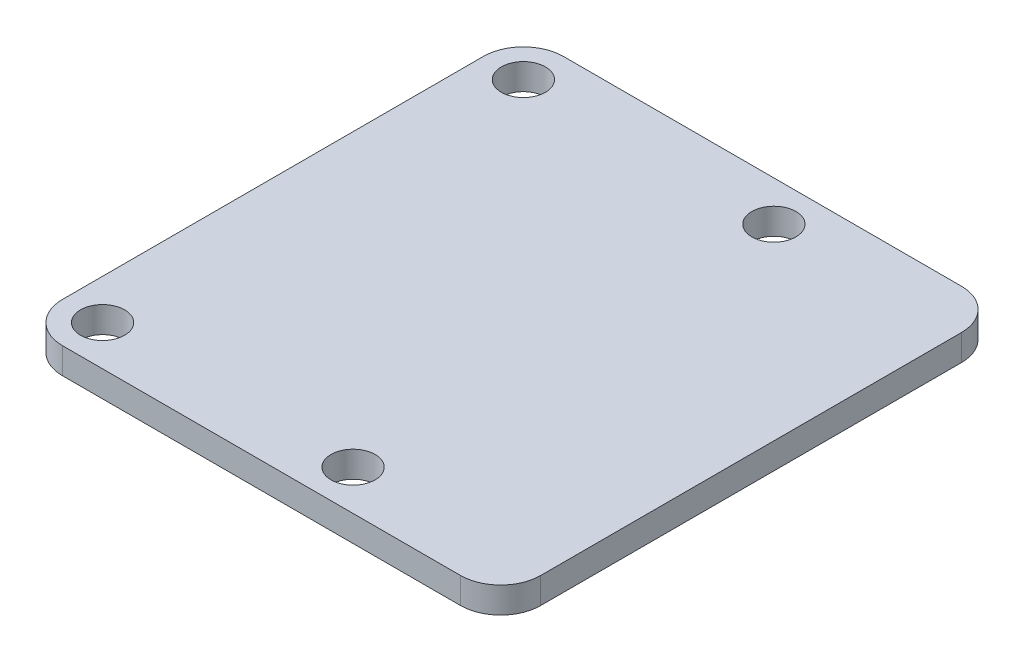
ISO-10303-21;
HEADER;
FILE_DESCRIPTION(('STEP AP214'),'2;1');
FILE_NAME('part.step','',(''),(''),'','','');
FILE_SCHEMA(('AUTOMOTIVE_DESIGN { 1 0 10303 214 1 1 1 1 }'));
ENDSEC;
DATA;
#1=APPLICATION_CONTEXT('core data for automotive mechanical design processes');
#2=APPLICATION_PROTOCOL_DEFINITION('international standard','automotive_design',2000,#1);
#3=PRODUCT_CONTEXT('',#1,'mechanical');
#4=PRODUCT('Part','Part','',(#3));
#5=PRODUCT_RELATED_PRODUCT_CATEGORY('part','',(#4));
#6=PRODUCT_DEFINITION_FORMATION('','',#4);
#7=PRODUCT_DEFINITION_CONTEXT('part definition',#1,'design');
#8=PRODUCT_DEFINITION('design','',#6,#7);
#9=PRODUCT_DEFINITION_SHAPE('','',#8);
#10=(LENGTH_UNIT() NAMED_UNIT(*) SI_UNIT(.MILLI.,.METRE.));
#11=(NAMED_UNIT(*) PLANE_ANGLE_UNIT() SI_UNIT($,.RADIAN.));
#12=(NAMED_UNIT(*) SI_UNIT($,.STERADIAN.) SOLID_ANGLE_UNIT());
#13=UNCERTAINTY_MEASURE_WITH_UNIT(LENGTH_MEASURE(1.E-05),#10,'distance_accuracy_value','');
#14=(GEOMETRIC_REPRESENTATION_CONTEXT(3) GLOBAL_UNCERTAINTY_ASSIGNED_CONTEXT((#13)) GLOBAL_UNIT_ASSIGNED_CONTEXT((#10,
#11,#12)) REPRESENTATION_CONTEXT('',''));
#15=CARTESIAN_POINT('',(0.,0.,0.));
#16=DIRECTION('',(0.,0.,1.));
#17=DIRECTION('',(1.,0.,0.));
#18=AXIS2_PLACEMENT_3D('',#15,#16,#17);
#19=CARTESIAN_POINT('',(0.,0.,0.));
#20=DIRECTION('',(0.,1.,0.));
#21=DIRECTION('',(0.,0.,1.));
#22=AXIS2_PLACEMENT_3D('',#19,#20,#21);
#23=PLANE('',#22);
#24=CARTESIAN_POINT('',(2.56900000000003,0.,-10.5));
#25=DIRECTION('',(0.,1.,0.));
#26=DIRECTION('',(0.,0.,1.));
#27=AXIS2_PLACEMENT_3D('',#24,#25,#26);
#28=CIRCLE('',#27,1.1);
#29=CARTESIAN_POINT('',(2.56900000000003,0.,-9.4));
#30=VERTEX_POINT('',#29);
#31=EDGE_CURVE('E150',#30,#30,#28,.T.);
#32=ORIENTED_EDGE('',*,*,#31,.T.);
#33=EDGE_LOOP('',(#32));
#34=FACE_BOUND('',#33,.T.);
#35=CARTESIAN_POINT('',(-9.93099999999997,0.,-10.5));
#36=DIRECTION('',(0.,1.,0.));
#37=DIRECTION('',(0.,0.,1.));
#38=AXIS2_PLACEMENT_3D('',#35,#36,#37);
#39=CIRCLE('',#38,1.1);
#40=CARTESIAN_POINT('',(-9.93099999999997,0.,-9.4));
#41=VERTEX_POINT('',#40);
#42=EDGE_CURVE('E160',#41,#41,#39,.T.);
#43=ORIENTED_EDGE('',*,*,#42,.T.);
#44=EDGE_LOOP('',(#43));
#45=FACE_BOUND('',#44,.T.);
#46=CARTESIAN_POINT('',(2.56900000000003,0.,10.5));
#47=DIRECTION('',(0.,1.,0.));
#48=DIRECTION('',(0.,0.,1.));
#49=AXIS2_PLACEMENT_3D('',#46,#47,#48);
#50=CIRCLE('',#49,1.1);
#51=CARTESIAN_POINT('',(2.56900000000003,0.,11.6));
#52=VERTEX_POINT('',#51);
#53=EDGE_CURVE('E165',#52,#52,#50,.T.);
#54=ORIENTED_EDGE('',*,*,#53,.T.);
#55=EDGE_LOOP('',(#54));
#56=FACE_BOUND('',#55,.T.);
#57=CARTESIAN_POINT('',(-9.93099999999997,0.,10.5));
#58=DIRECTION('',(0.,1.,0.));
#59=DIRECTION('',(0.,0.,1.));
#60=AXIS2_PLACEMENT_3D('',#57,#58,#59);
#61=CIRCLE('',#60,1.1);
#62=CARTESIAN_POINT('',(-9.93099999999997,0.,11.6));
#63=VERTEX_POINT('',#62);
#64=EDGE_CURVE('E171',#63,#63,#61,.T.);
#65=ORIENTED_EDGE('',*,*,#64,.T.);
#66=EDGE_LOOP('',(#65));
#67=FACE_BOUND('',#66,.T.);
#68=DIRECTION('',(-1.,0.,0.));
#69=VECTOR('',#68,1.);
#70=CARTESIAN_POINT('',(-11.931,0.,-12.5));
#71=LINE('',#70,#69);
#72=CARTESIAN_POINT('',(9.93099999999997,0.,-12.5));
#73=VERTEX_POINT('',#72);
#74=CARTESIAN_POINT('',(-9.93099999999997,0.,-12.5));
#75=VERTEX_POINT('',#74);
#76=EDGE_CURVE('E194',#73,#75,#71,.T.);
#77=ORIENTED_EDGE('',*,*,#76,.F.);
#78=CARTESIAN_POINT('',(9.93099999999997,0.,-10.5));
#79=DIRECTION('',(0.,1.,0.));
#80=DIRECTION('',(0.,0.,1.));
#81=AXIS2_PLACEMENT_3D('',#78,#79,#80);
#82=CIRCLE('',#81,2.);
#83=CARTESIAN_POINT('',(11.931,0.,-10.5));
#84=VERTEX_POINT('',#83);
#85=EDGE_CURVE('E214',#73,#84,#82,.F.);
#86=ORIENTED_EDGE('',*,*,#85,.T.);
#87=DIRECTION('',(0.,0.,-1.));
#88=VECTOR('',#87,1.);
#89=CARTESIAN_POINT('',(11.931,0.,-12.5));
#90=LINE('',#89,#88);
#91=CARTESIAN_POINT('',(11.931,0.,10.5));
#92=VERTEX_POINT('',#91);
#93=EDGE_CURVE('E177',#92,#84,#90,.T.);
#94=ORIENTED_EDGE('',*,*,#93,.F.);
#95=CARTESIAN_POINT('',(9.93099999999997,0.,10.5));
#96=DIRECTION('',(0.,1.,0.));
#97=DIRECTION('',(0.,0.,1.));
#98=AXIS2_PLACEMENT_3D('',#95,#96,#97);
#99=CIRCLE('',#98,2.);
#100=CARTESIAN_POINT('',(9.93099999999997,0.,12.5));
#101=VERTEX_POINT('',#100);
#102=EDGE_CURVE('E208',#92,#101,#99,.F.);
#103=ORIENTED_EDGE('',*,*,#102,.T.);
#104=DIRECTION('',(1.,0.,0.));
#105=VECTOR('',#104,1.);
#106=CARTESIAN_POINT('',(-11.931,0.,12.5));
#107=LINE('',#106,#105);
#108=CARTESIAN_POINT('',(-9.93099999999997,0.,12.5));
#109=VERTEX_POINT('',#108);
#110=EDGE_CURVE('E184',#109,#101,#107,.T.);
#111=ORIENTED_EDGE('',*,*,#110,.F.);
#112=CARTESIAN_POINT('',(-9.93099999999997,0.,10.5));
#113=DIRECTION('',(0.,1.,0.));
#114=DIRECTION('',(0.,0.,1.));
#115=AXIS2_PLACEMENT_3D('',#112,#113,#114);
#116=CIRCLE('',#115,2.);
#117=CARTESIAN_POINT('',(-11.931,0.,10.5));
#118=VERTEX_POINT('',#117);
#119=EDGE_CURVE('E210',#109,#118,#116,.F.);
#120=ORIENTED_EDGE('',*,*,#119,.T.);
#121=DIRECTION('',(0.,0.,1.));
#122=VECTOR('',#121,1.);
#123=CARTESIAN_POINT('',(-11.931,0.,-12.5));
#124=LINE('',#123,#122);
#125=CARTESIAN_POINT('',(-11.931,0.,-10.5));
#126=VERTEX_POINT('',#125);
#127=EDGE_CURVE('E197',#126,#118,#124,.T.);
#128=ORIENTED_EDGE('',*,*,#127,.F.);
#129=CARTESIAN_POINT('',(-9.93099999999997,0.,-10.5));
#130=DIRECTION('',(0.,1.,0.));
#131=DIRECTION('',(0.,0.,1.));
#132=AXIS2_PLACEMENT_3D('',#129,#130,#131);
#133=CIRCLE('',#132,2.);
#134=EDGE_CURVE('E212',#126,#75,#133,.F.);
#135=ORIENTED_EDGE('',*,*,#134,.T.);
#136=EDGE_LOOP('',(#77,#86,#94,#103,#111,#120,#128,#135));
#137=FACE_BOUND('',#136,.T.);
#138=DIRECTION('',(0.,0.,1.));
#139=VECTOR('',#138,1.);
#140=CARTESIAN_POINT('',(6.46899999999997,0.,-4.));
#141=LINE('',#140,#139);
#142=CARTESIAN_POINT('',(6.46899999999997,0.,-4.));
#143=VERTEX_POINT('',#142);
#144=CARTESIAN_POINT('',(6.46899999999997,0.,4.));
#145=VERTEX_POINT('',#144);
#146=EDGE_CURVE('E149',#143,#145,#141,.T.);
#147=ORIENTED_EDGE('',*,*,#146,.F.);
#148=DIRECTION('',(1.,0.,0.));
#149=VECTOR('',#148,1.);
#150=CARTESIAN_POINT('',(-1.53100000000003,0.,-4.));
#151=LINE('',#150,#149);
#152=CARTESIAN_POINT('',(-1.53100000000003,0.,-4.));
#153=VERTEX_POINT('',#152);
#154=EDGE_CURVE('E146',#153,#143,#151,.T.);
#155=ORIENTED_EDGE('',*,*,#154,.F.);
#156=DIRECTION('',(0.,0.,-1.));
#157=VECTOR('',#156,1.);
#158=CARTESIAN_POINT('',(-1.53100000000003,0.,-4.));
#159=LINE('',#158,#157);
#160=CARTESIAN_POINT('',(-1.53100000000003,0.,4.));
#161=VERTEX_POINT('',#160);
#162=EDGE_CURVE('E464',#161,#153,#159,.T.);
#163=ORIENTED_EDGE('',*,*,#162,.F.);
#164=DIRECTION('',(-1.,0.,0.));
#165=VECTOR('',#164,1.);
#166=CARTESIAN_POINT('',(-1.53100000000003,0.,4.));
#167=LINE('',#166,#165);
#168=EDGE_CURVE('E457',#145,#161,#167,.T.);
#169=ORIENTED_EDGE('',*,*,#168,.F.);
#170=EDGE_LOOP('',(#147,#155,#163,#169));
#171=FACE_BOUND('',#170,.T.);
#172=ADVANCED_FACE('F35',(#34,#45,#56,#67,#137,#171),#23,.F.);
#173=CARTESIAN_POINT('',(0.,1.3,0.));
#174=DIRECTION('',(0.,1.,0.));
#175=DIRECTION('',(0.,0.,1.));
#176=AXIS2_PLACEMENT_3D('',#173,#174,#175);
#177=PLANE('',#176);
#178=CARTESIAN_POINT('',(-9.93099999999997,1.3,-10.5));
#179=DIRECTION('',(0.,1.,0.));
#180=DIRECTION('',(0.,0.,1.));
#181=AXIS2_PLACEMENT_3D('',#178,#179,#180);
#182=CIRCLE('',#181,1.1);
#183=CARTESIAN_POINT('',(-9.93099999999997,1.3,-9.4));
#184=VERTEX_POINT('',#183);
#185=EDGE_CURVE('E162',#184,#184,#182,.T.);
#186=ORIENTED_EDGE('',*,*,#185,.F.);
#187=EDGE_LOOP('',(#186));
#188=FACE_BOUND('',#187,.T.);
#189=CARTESIAN_POINT('',(-9.93099999999997,1.3,10.5));
#190=DIRECTION('',(0.,1.,0.));
#191=DIRECTION('',(0.,0.,1.));
#192=AXIS2_PLACEMENT_3D('',#189,#190,#191);
#193=CIRCLE('',#192,1.1);
#194=CARTESIAN_POINT('',(-9.93099999999997,1.3,11.6));
#195=VERTEX_POINT('',#194);
#196=EDGE_CURVE('E174',#195,#195,#193,.T.);
#197=ORIENTED_EDGE('',*,*,#196,.F.);
#198=EDGE_LOOP('',(#197));
#199=FACE_BOUND('',#198,.T.);
#200=DIRECTION('',(0.,0.,-1.));
#201=VECTOR('',#200,1.);
#202=CARTESIAN_POINT('',(11.931,1.3,-12.5));
#203=LINE('',#202,#201);
#204=CARTESIAN_POINT('',(11.931,1.3,10.5));
#205=VERTEX_POINT('',#204);
#206=CARTESIAN_POINT('',(11.931,1.3,-10.5));
#207=VERTEX_POINT('',#206);
#208=EDGE_CURVE('E180',#205,#207,#203,.T.);
#209=ORIENTED_EDGE('',*,*,#208,.T.);
#210=CARTESIAN_POINT('',(9.93099999999997,1.3,-10.5));
#211=DIRECTION('',(0.,1.,0.));
#212=DIRECTION('',(0.,0.,1.));
#213=AXIS2_PLACEMENT_3D('',#210,#211,#212);
#214=CIRCLE('',#213,2.);
#215=CARTESIAN_POINT('',(9.93099999999997,1.3,-12.5));
#216=VERTEX_POINT('',#215);
#217=EDGE_CURVE('E226',#207,#216,#214,.T.);
#218=ORIENTED_EDGE('',*,*,#217,.T.);
#219=DIRECTION('',(-1.,0.,0.));
#220=VECTOR('',#219,1.);
#221=CARTESIAN_POINT('',(-11.931,1.3,-12.5));
#222=LINE('',#221,#220);
#223=CARTESIAN_POINT('',(-9.93099999999997,1.3,-12.5));
#224=VERTEX_POINT('',#223);
#225=EDGE_CURVE('E183',#216,#224,#222,.T.);
#226=ORIENTED_EDGE('',*,*,#225,.T.);
#227=CARTESIAN_POINT('',(-9.93099999999997,1.3,-10.5));
#228=DIRECTION('',(0.,1.,0.));
#229=DIRECTION('',(0.,0.,1.));
#230=AXIS2_PLACEMENT_3D('',#227,#228,#229);
#231=CIRCLE('',#230,2.);
#232=CARTESIAN_POINT('',(-11.931,1.3,-10.5));
#233=VERTEX_POINT('',#232);
#234=EDGE_CURVE('E224',#224,#233,#231,.T.);
#235=ORIENTED_EDGE('',*,*,#234,.T.);
#236=DIRECTION('',(0.,0.,1.));
#237=VECTOR('',#236,1.);
#238=CARTESIAN_POINT('',(-11.931,1.3,-12.5));
#239=LINE('',#238,#237);
#240=CARTESIAN_POINT('',(-11.931,1.3,10.5));
#241=VERTEX_POINT('',#240);
#242=EDGE_CURVE('E187',#233,#241,#239,.T.);
#243=ORIENTED_EDGE('',*,*,#242,.T.);
#244=CARTESIAN_POINT('',(-9.93099999999997,1.3,10.5));
#245=DIRECTION('',(0.,1.,0.));
#246=DIRECTION('',(0.,0.,1.));
#247=AXIS2_PLACEMENT_3D('',#244,#245,#246);
#248=CIRCLE('',#247,2.);
#249=CARTESIAN_POINT('',(-9.93099999999997,1.3,12.5));
#250=VERTEX_POINT('',#249);
#251=EDGE_CURVE('E56',#241,#250,#248,.T.);
#252=ORIENTED_EDGE('',*,*,#251,.T.);
#253=DIRECTION('',(1.,0.,0.));
#254=VECTOR('',#253,1.);
#255=CARTESIAN_POINT('',(-11.931,1.3,12.5));
#256=LINE('',#255,#254);
#257=CARTESIAN_POINT('',(9.93099999999997,1.3,12.5));
#258=VERTEX_POINT('',#257);
#259=EDGE_CURVE('E189',#250,#258,#256,.T.);
#260=ORIENTED_EDGE('',*,*,#259,.T.);
#261=CARTESIAN_POINT('',(9.93099999999997,1.3,10.5));
#262=DIRECTION('',(0.,1.,0.));
#263=DIRECTION('',(0.,0.,1.));
#264=AXIS2_PLACEMENT_3D('',#261,#262,#263);
#265=CIRCLE('',#264,2.);
#266=EDGE_CURVE('E221',#258,#205,#265,.T.);
#267=ORIENTED_EDGE('',*,*,#266,.T.);
#268=EDGE_LOOP('',(#209,#218,#226,#235,#243,#252,#260,#267));
#269=FACE_BOUND('',#268,.T.);
#270=CARTESIAN_POINT('',(2.56900000000003,1.3,10.5));
#271=DIRECTION('',(0.,1.,0.));
#272=DIRECTION('',(0.,0.,1.));
#273=AXIS2_PLACEMENT_3D('',#270,#271,#272);
#274=CIRCLE('',#273,1.1);
#275=CARTESIAN_POINT('',(2.56900000000003,1.3,11.6));
#276=VERTEX_POINT('',#275);
#277=EDGE_CURVE('E168',#276,#276,#274,.T.);
#278=ORIENTED_EDGE('',*,*,#277,.F.);
#279=EDGE_LOOP('',(#278));
#280=FACE_BOUND('',#279,.T.);
#281=CARTESIAN_POINT('',(2.56900000000003,1.3,-10.5));
#282=DIRECTION('',(0.,1.,0.));
#283=DIRECTION('',(0.,0.,1.));
#284=AXIS2_PLACEMENT_3D('',#281,#282,#283);
#285=CIRCLE('',#284,1.1);
#286=CARTESIAN_POINT('',(2.56900000000003,1.3,-9.4));
#287=VERTEX_POINT('',#286);
#288=EDGE_CURVE('E153',#287,#287,#285,.T.);
#289=ORIENTED_EDGE('',*,*,#288,.F.);
#290=EDGE_LOOP('',(#289));
#291=FACE_BOUND('',#290,.T.);
#292=ADVANCED_FACE('F249',(#188,#199,#269,#280,#291),#177,.T.);
#293=CARTESIAN_POINT('',(11.931,1.3,-12.5));
#294=DIRECTION('',(-1.,0.,0.));
#295=DIRECTION('',(0.,0.,1.));
#296=AXIS2_PLACEMENT_3D('',#293,#294,#295);
#297=PLANE('',#296);
#298=ORIENTED_EDGE('',*,*,#93,.T.);
#299=DIRECTION('',(0.,-1.,0.));
#300=VECTOR('',#299,1.);
#301=CARTESIAN_POINT('',(11.931,1.3,-10.5));
#302=LINE('',#301,#300);
#303=EDGE_CURVE('E219',#84,#207,#302,.F.);
#304=ORIENTED_EDGE('',*,*,#303,.T.);
#305=ORIENTED_EDGE('',*,*,#208,.F.);
#306=DIRECTION('',(0.,-1.,0.));
#307=VECTOR('',#306,1.);
#308=CARTESIAN_POINT('',(11.931,1.3,10.5));
#309=LINE('',#308,#307);
#310=EDGE_CURVE('E216',#205,#92,#309,.T.);
#311=ORIENTED_EDGE('',*,*,#310,.T.);
#312=EDGE_LOOP('',(#298,#304,#305,#311));
#313=FACE_BOUND('',#312,.T.);
#314=ADVANCED_FACE('F256',(#313),#297,.F.);
#315=CARTESIAN_POINT('',(-11.931,1.3,-12.5));
#316=DIRECTION('',(0.,0.,1.));
#317=DIRECTION('',(1.,0.,0.));
#318=AXIS2_PLACEMENT_3D('',#315,#316,#317);
#319=PLANE('',#318);
#320=ORIENTED_EDGE('',*,*,#225,.F.);
#321=DIRECTION('',(0.,-1.,0.));
#322=VECTOR('',#321,1.);
#323=CARTESIAN_POINT('',(9.93099999999997,1.3,-12.5));
#324=LINE('',#323,#322);
#325=EDGE_CURVE('E205',#216,#73,#324,.T.);
#326=ORIENTED_EDGE('',*,*,#325,.T.);
#327=ORIENTED_EDGE('',*,*,#76,.T.);
#328=DIRECTION('',(0.,-1.,0.));
#329=VECTOR('',#328,1.);
#330=CARTESIAN_POINT('',(-9.93099999999997,1.3,-12.5));
#331=LINE('',#330,#329);
#332=EDGE_CURVE('E203',#75,#224,#331,.F.);
#333=ORIENTED_EDGE('',*,*,#332,.T.);
#334=EDGE_LOOP('',(#320,#326,#327,#333));
#335=FACE_BOUND('',#334,.T.);
#336=ADVANCED_FACE('F264',(#335),#319,.F.);
#337=CARTESIAN_POINT('',(-11.931,1.3,-12.5));
#338=DIRECTION('',(1.,0.,0.));
#339=DIRECTION('',(0.,0.,-1.));
#340=AXIS2_PLACEMENT_3D('',#337,#338,#339);
#341=PLANE('',#340);
#342=ORIENTED_EDGE('',*,*,#242,.F.);
#343=DIRECTION('',(0.,-1.,0.));
#344=VECTOR('',#343,1.);
#345=CARTESIAN_POINT('',(-11.931,1.3,-10.5));
#346=LINE('',#345,#344);
#347=EDGE_CURVE('E230',#233,#126,#346,.T.);
#348=ORIENTED_EDGE('',*,*,#347,.T.);
#349=ORIENTED_EDGE('',*,*,#127,.T.);
#350=DIRECTION('',(0.,-1.,0.));
#351=VECTOR('',#350,1.);
#352=CARTESIAN_POINT('',(-11.931,1.3,10.5));
#353=LINE('',#352,#351);
#354=EDGE_CURVE('E228',#118,#241,#353,.F.);
#355=ORIENTED_EDGE('',*,*,#354,.T.);
#356=EDGE_LOOP('',(#342,#348,#349,#355));
#357=FACE_BOUND('',#356,.T.);
#358=ADVANCED_FACE('F236',(#357),#341,.F.);
#359=CARTESIAN_POINT('',(-11.931,1.3,12.5));
#360=DIRECTION('',(0.,0.,-1.));
#361=DIRECTION('',(-1.,0.,0.));
#362=AXIS2_PLACEMENT_3D('',#359,#360,#361);
#363=PLANE('',#362);
#364=ORIENTED_EDGE('',*,*,#259,.F.);
#365=DIRECTION('',(0.,-1.,0.));
#366=VECTOR('',#365,1.);
#367=CARTESIAN_POINT('',(-9.93099999999997,1.3,12.5));
#368=LINE('',#367,#366);
#369=EDGE_CURVE('E11',#250,#109,#368,.T.);
#370=ORIENTED_EDGE('',*,*,#369,.T.);
#371=ORIENTED_EDGE('',*,*,#110,.T.);
#372=DIRECTION('',(0.,-1.,0.));
#373=VECTOR('',#372,1.);
#374=CARTESIAN_POINT('',(9.93099999999997,1.3,12.5));
#375=LINE('',#374,#373);
#376=EDGE_CURVE('E43',#101,#258,#375,.F.);
#377=ORIENTED_EDGE('',*,*,#376,.T.);
#378=EDGE_LOOP('',(#364,#370,#371,#377));
#379=FACE_BOUND('',#378,.T.);
#380=ADVANCED_FACE('F247',(#379),#363,.F.);
#381=CARTESIAN_POINT('',(-9.93099999999997,1.3,10.5));
#382=DIRECTION('',(0.,-1.,0.));
#383=DIRECTION('',(0.,0.,-1.));
#384=AXIS2_PLACEMENT_3D('',#381,#382,#383);
#385=CYLINDRICAL_SURFACE('',#384,1.1);
#386=ORIENTED_EDGE('',*,*,#196,.T.);
#387=EDGE_LOOP('',(#386));
#388=FACE_BOUND('',#387,.T.);
#389=ORIENTED_EDGE('',*,*,#64,.F.);
#390=EDGE_LOOP('',(#389));
#391=FACE_BOUND('',#390,.T.);
#392=ADVANCED_FACE('F288',(#388,#391),#385,.F.);
#393=CARTESIAN_POINT('',(2.56900000000003,1.3,10.5));
#394=DIRECTION('',(0.,-1.,0.));
#395=DIRECTION('',(0.,0.,-1.));
#396=AXIS2_PLACEMENT_3D('',#393,#394,#395);
#397=CYLINDRICAL_SURFACE('',#396,1.1);
#398=ORIENTED_EDGE('',*,*,#277,.T.);
#399=EDGE_LOOP('',(#398));
#400=FACE_BOUND('',#399,.T.);
#401=ORIENTED_EDGE('',*,*,#53,.F.);
#402=EDGE_LOOP('',(#401));
#403=FACE_BOUND('',#402,.T.);
#404=ADVANCED_FACE('F317',(#400,#403),#397,.F.);
#405=CARTESIAN_POINT('',(-9.93099999999997,1.3,-10.5));
#406=DIRECTION('',(0.,-1.,0.));
#407=DIRECTION('',(0.,0.,-1.));
#408=AXIS2_PLACEMENT_3D('',#405,#406,#407);
#409=CYLINDRICAL_SURFACE('',#408,1.1);
#410=ORIENTED_EDGE('',*,*,#185,.T.);
#411=EDGE_LOOP('',(#410));
#412=FACE_BOUND('',#411,.T.);
#413=ORIENTED_EDGE('',*,*,#42,.F.);
#414=EDGE_LOOP('',(#413));
#415=FACE_BOUND('',#414,.T.);
#416=ADVANCED_FACE('F324',(#412,#415),#409,.F.);
#417=CARTESIAN_POINT('',(2.56900000000003,1.3,-10.5));
#418=DIRECTION('',(0.,-1.,0.));
#419=DIRECTION('',(0.,0.,-1.));
#420=AXIS2_PLACEMENT_3D('',#417,#418,#419);
#421=CYLINDRICAL_SURFACE('',#420,1.1);
#422=ORIENTED_EDGE('',*,*,#288,.T.);
#423=EDGE_LOOP('',(#422));
#424=FACE_BOUND('',#423,.T.);
#425=ORIENTED_EDGE('',*,*,#31,.F.);
#426=EDGE_LOOP('',(#425));
#427=FACE_BOUND('',#426,.T.);
#428=ADVANCED_FACE('F332',(#424,#427),#421,.F.);
#429=CARTESIAN_POINT('',(6.46899999999997,-2.,-4.));
#430=DIRECTION('',(-1.,0.,0.));
#431=DIRECTION('',(0.,0.,1.));
#432=AXIS2_PLACEMENT_3D('',#429,#430,#431);
#433=PLANE('',#432);
#434=ORIENTED_EDGE('',*,*,#146,.T.);
#435=DIRECTION('',(0.,1.,0.));
#436=VECTOR('',#435,1.);
#437=CARTESIAN_POINT('',(6.46899999999997,-2.,4.));
#438=LINE('',#437,#436);
#439=CARTESIAN_POINT('',(6.46899999999997,-2.,4.));
#440=VERTEX_POINT('',#439);
#441=EDGE_CURVE('E130',#440,#145,#438,.T.);
#442=ORIENTED_EDGE('',*,*,#441,.F.);
#443=DIRECTION('',(0.,0.,1.));
#444=VECTOR('',#443,1.);
#445=CARTESIAN_POINT('',(6.46899999999997,-2.,-4.));
#446=LINE('',#445,#444);
#447=CARTESIAN_POINT('',(6.46899999999997,-2.,-4.));
#448=VERTEX_POINT('',#447);
#449=EDGE_CURVE('E137',#448,#440,#446,.T.);
#450=ORIENTED_EDGE('',*,*,#449,.F.);
#451=DIRECTION('',(0.,1.,0.));
#452=VECTOR('',#451,1.);
#453=CARTESIAN_POINT('',(6.46899999999997,-2.,-4.));
#454=LINE('',#453,#452);
#455=EDGE_CURVE('E461',#448,#143,#454,.T.);
#456=ORIENTED_EDGE('',*,*,#455,.T.);
#457=EDGE_LOOP('',(#434,#442,#450,#456));
#458=FACE_BOUND('',#457,.T.);
#459=ADVANCED_FACE('F148',(#458),#433,.F.);
#460=CARTESIAN_POINT('',(-1.53100000000003,-2.,4.));
#461=DIRECTION('',(0.,0.,-1.));
#462=DIRECTION('',(-1.,0.,0.));
#463=AXIS2_PLACEMENT_3D('',#460,#461,#462);
#464=PLANE('',#463);
#465=ORIENTED_EDGE('',*,*,#168,.T.);
#466=DIRECTION('',(0.,1.,0.));
#467=VECTOR('',#466,1.);
#468=CARTESIAN_POINT('',(-1.53100000000003,-2.,4.));
#469=LINE('',#468,#467);
#470=CARTESIAN_POINT('',(-1.53100000000003,-2.,4.));
#471=VERTEX_POINT('',#470);
#472=EDGE_CURVE('E133',#471,#161,#469,.T.);
#473=ORIENTED_EDGE('',*,*,#472,.F.);
#474=DIRECTION('',(-1.,0.,0.));
#475=VECTOR('',#474,1.);
#476=CARTESIAN_POINT('',(-1.53100000000003,-2.,4.));
#477=LINE('',#476,#475);
#478=EDGE_CURVE('E125',#440,#471,#477,.T.);
#479=ORIENTED_EDGE('',*,*,#478,.F.);
#480=ORIENTED_EDGE('',*,*,#441,.T.);
#481=EDGE_LOOP('',(#465,#473,#479,#480));
#482=FACE_BOUND('',#481,.T.);
#483=ADVANCED_FACE('F128',(#482),#464,.F.);
#484=CARTESIAN_POINT('',(-1.53100000000003,-2.,-4.));
#485=DIRECTION('',(1.,0.,0.));
#486=DIRECTION('',(0.,0.,-1.));
#487=AXIS2_PLACEMENT_3D('',#484,#485,#486);
#488=PLANE('',#487);
#489=ORIENTED_EDGE('',*,*,#162,.T.);
#490=DIRECTION('',(0.,1.,0.));
#491=VECTOR('',#490,1.);
#492=CARTESIAN_POINT('',(-1.53100000000003,-2.,-4.));
#493=LINE('',#492,#491);
#494=CARTESIAN_POINT('',(-1.53100000000003,-2.,-4.));
#495=VERTEX_POINT('',#494);
#496=EDGE_CURVE('E155',#495,#153,#493,.T.);
#497=ORIENTED_EDGE('',*,*,#496,.F.);
#498=DIRECTION('',(0.,0.,-1.));
#499=VECTOR('',#498,1.);
#500=CARTESIAN_POINT('',(-1.53100000000003,-2.,-4.));
#501=LINE('',#500,#499);
#502=EDGE_CURVE('E136',#471,#495,#501,.T.);
#503=ORIENTED_EDGE('',*,*,#502,.F.);
#504=ORIENTED_EDGE('',*,*,#472,.T.);
#505=EDGE_LOOP('',(#489,#497,#503,#504));
#506=FACE_BOUND('',#505,.T.);
#507=ADVANCED_FACE('F353',(#506),#488,.F.);
#508=CARTESIAN_POINT('',(-1.53100000000003,-2.,-4.));
#509=DIRECTION('',(0.,0.,1.));
#510=DIRECTION('',(1.,0.,0.));
#511=AXIS2_PLACEMENT_3D('',#508,#509,#510);
#512=PLANE('',#511);
#513=ORIENTED_EDGE('',*,*,#154,.T.);
#514=ORIENTED_EDGE('',*,*,#455,.F.);
#515=DIRECTION('',(1.,0.,0.));
#516=VECTOR('',#515,1.);
#517=CARTESIAN_POINT('',(-1.53100000000003,-2.,-4.));
#518=LINE('',#517,#516);
#519=EDGE_CURVE('E142',#495,#448,#518,.T.);
#520=ORIENTED_EDGE('',*,*,#519,.F.);
#521=ORIENTED_EDGE('',*,*,#496,.T.);
#522=EDGE_LOOP('',(#513,#514,#520,#521));
#523=FACE_BOUND('',#522,.T.);
#524=ADVANCED_FACE('F360',(#523),#512,.F.);
#525=CARTESIAN_POINT('',(0.,-2.,0.));
#526=DIRECTION('',(0.,1.,0.));
#527=DIRECTION('',(0.,0.,1.));
#528=AXIS2_PLACEMENT_3D('',#525,#526,#527);
#529=PLANE('',#528);
#530=CARTESIAN_POINT('',(2.46899999999997,-2.,0.));
#531=DIRECTION('',(0.,1.,0.));
#532=DIRECTION('',(0.,0.,1.));
#533=AXIS2_PLACEMENT_3D('',#530,#531,#532);
#534=CIRCLE('',#533,3.5);
#535=CARTESIAN_POINT('',(2.46899999999997,-2.,3.5));
#536=VERTEX_POINT('',#535);
#537=EDGE_CURVE('E191',#536,#536,#534,.F.);
#538=ORIENTED_EDGE('',*,*,#537,.F.);
#539=EDGE_LOOP('',(#538));
#540=FACE_BOUND('',#539,.T.);
#541=ORIENTED_EDGE('',*,*,#449,.T.);
#542=ORIENTED_EDGE('',*,*,#478,.T.);
#543=ORIENTED_EDGE('',*,*,#502,.T.);
#544=ORIENTED_EDGE('',*,*,#519,.T.);
#545=EDGE_LOOP('',(#541,#542,#543,#544));
#546=FACE_BOUND('',#545,.T.);
#547=ADVANCED_FACE('F140',(#540,#546),#529,.F.);
#548=CARTESIAN_POINT('',(2.46899999999997,-4.,0.));
#549=DIRECTION('',(0.,1.,0.));
#550=DIRECTION('',(0.,0.,1.));
#551=AXIS2_PLACEMENT_3D('',#548,#549,#550);
#552=CYLINDRICAL_SURFACE('',#551,3.5);
#553=CARTESIAN_POINT('',(2.46899999999997,-4.,0.));
#554=DIRECTION('',(0.,-1.,0.));
#555=DIRECTION('',(0.,0.,-1.));
#556=AXIS2_PLACEMENT_3D('',#553,#554,#555);
#557=CIRCLE('',#556,3.5);
#558=CARTESIAN_POINT('',(2.46899999999997,-4.,-3.5));
#559=VERTEX_POINT('',#558);
#560=EDGE_CURVE('E455',#559,#559,#557,.T.);
#561=ORIENTED_EDGE('',*,*,#560,.F.);
#562=EDGE_LOOP('',(#561));
#563=FACE_BOUND('',#562,.T.);
#564=ORIENTED_EDGE('',*,*,#537,.T.);
#565=EDGE_LOOP('',(#564));
#566=FACE_BOUND('',#565,.T.);
#567=ADVANCED_FACE('F375',(#563,#566),#552,.T.);
#568=CARTESIAN_POINT('',(2.46899999999997,-4.,0.));
#569=DIRECTION('',(0.,-1.,0.));
#570=DIRECTION('',(0.,0.,-1.));
#571=AXIS2_PLACEMENT_3D('',#568,#569,#570);
#572=PLANE('',#571);
#573=ORIENTED_EDGE('',*,*,#560,.T.);
#574=EDGE_LOOP('',(#573));
#575=FACE_BOUND('',#574,.T.);
#576=ADVANCED_FACE('F273',(#575),#572,.T.);
#577=CARTESIAN_POINT('',(9.93099999999997,1.3,-10.5));
#578=DIRECTION('',(0.,-1.,0.));
#579=DIRECTION('',(0.,0.,-1.));
#580=AXIS2_PLACEMENT_3D('',#577,#578,#579);
#581=CYLINDRICAL_SURFACE('',#580,2.);
#582=ORIENTED_EDGE('',*,*,#217,.F.);
#583=ORIENTED_EDGE('',*,*,#303,.F.);
#584=ORIENTED_EDGE('',*,*,#85,.F.);
#585=ORIENTED_EDGE('',*,*,#325,.F.);
#586=EDGE_LOOP('',(#582,#583,#584,#585));
#587=FACE_BOUND('',#586,.T.);
#588=ADVANCED_FACE('F261',(#587),#581,.T.);
#589=CARTESIAN_POINT('',(-9.93099999999997,1.3,-10.5));
#590=DIRECTION('',(0.,-1.,0.));
#591=DIRECTION('',(0.,0.,-1.));
#592=AXIS2_PLACEMENT_3D('',#589,#590,#591);
#593=CYLINDRICAL_SURFACE('',#592,2.);
#594=ORIENTED_EDGE('',*,*,#234,.F.);
#595=ORIENTED_EDGE('',*,*,#332,.F.);
#596=ORIENTED_EDGE('',*,*,#134,.F.);
#597=ORIENTED_EDGE('',*,*,#347,.F.);
#598=EDGE_LOOP('',(#594,#595,#596,#597));
#599=FACE_BOUND('',#598,.T.);
#600=ADVANCED_FACE('F266',(#599),#593,.T.);
#601=CARTESIAN_POINT('',(-9.93099999999997,1.3,10.5));
#602=DIRECTION('',(0.,-1.,0.));
#603=DIRECTION('',(0.,0.,-1.));
#604=AXIS2_PLACEMENT_3D('',#601,#602,#603);
#605=CYLINDRICAL_SURFACE('',#604,2.);
#606=ORIENTED_EDGE('',*,*,#251,.F.);
#607=ORIENTED_EDGE('',*,*,#354,.F.);
#608=ORIENTED_EDGE('',*,*,#119,.F.);
#609=ORIENTED_EDGE('',*,*,#369,.F.);
#610=EDGE_LOOP('',(#606,#607,#608,#609));
#611=FACE_BOUND('',#610,.T.);
#612=ADVANCED_FACE('F246',(#611),#605,.T.);
#613=CARTESIAN_POINT('',(9.93099999999997,1.3,10.5));
#614=DIRECTION('',(0.,-1.,0.));
#615=DIRECTION('',(0.,0.,-1.));
#616=AXIS2_PLACEMENT_3D('',#613,#614,#615);
#617=CYLINDRICAL_SURFACE('',#616,2.);
#618=ORIENTED_EDGE('',*,*,#266,.F.);
#619=ORIENTED_EDGE('',*,*,#376,.F.);
#620=ORIENTED_EDGE('',*,*,#102,.F.);
#621=ORIENTED_EDGE('',*,*,#310,.F.);
#622=EDGE_LOOP('',(#618,#619,#620,#621));
#623=FACE_BOUND('',#622,.T.);
#624=ADVANCED_FACE('F37',(#623),#617,.T.);
#625=CLOSED_SHELL('',(#172,#292,#314,#336,#358,#380,#392,#404,#416,#428,#459,#483,#507,#524,
#547,#567,#576,#588,#600,#612,#624));
#626=MANIFOLD_SOLID_BREP('B2',#625);
#627=ADVANCED_BREP_SHAPE_REPRESENTATION('',(#18,#626),#14);
#628=SHAPE_DEFINITION_REPRESENTATION(#9,#627);
ENDSEC;
END-ISO-10303-21;
